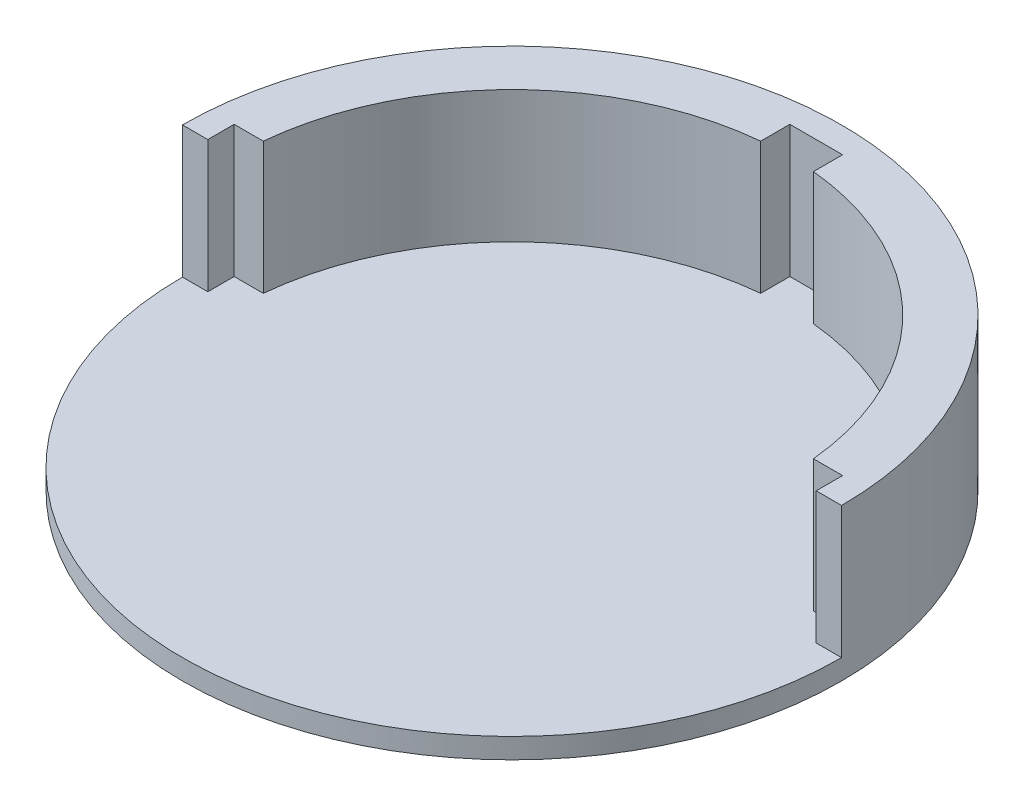
ISO-10303-21;
HEADER;
FILE_DESCRIPTION(('STEP AP214'),'2;1');
FILE_NAME('part.step','',(''),(''),'','','');
FILE_SCHEMA(('AUTOMOTIVE_DESIGN { 1 0 10303 214 1 1 1 1 }'));
ENDSEC;
DATA;
#1=APPLICATION_CONTEXT('core data for automotive mechanical design processes');
#2=APPLICATION_PROTOCOL_DEFINITION('international standard','automotive_design',2000,#1);
#3=PRODUCT_CONTEXT('',#1,'mechanical');
#4=PRODUCT('Part','Part','',(#3));
#5=PRODUCT_RELATED_PRODUCT_CATEGORY('part','',(#4));
#6=PRODUCT_DEFINITION_FORMATION('','',#4);
#7=PRODUCT_DEFINITION_CONTEXT('part definition',#1,'design');
#8=PRODUCT_DEFINITION('design','',#6,#7);
#9=PRODUCT_DEFINITION_SHAPE('','',#8);
#10=(LENGTH_UNIT() NAMED_UNIT(*) SI_UNIT(.MILLI.,.METRE.));
#11=(NAMED_UNIT(*) PLANE_ANGLE_UNIT() SI_UNIT($,.RADIAN.));
#12=(NAMED_UNIT(*) SI_UNIT($,.STERADIAN.) SOLID_ANGLE_UNIT());
#13=UNCERTAINTY_MEASURE_WITH_UNIT(LENGTH_MEASURE(1.E-05),#10,'distance_accuracy_value','');
#14=(GEOMETRIC_REPRESENTATION_CONTEXT(3) GLOBAL_UNCERTAINTY_ASSIGNED_CONTEXT((#13)) GLOBAL_UNIT_ASSIGNED_CONTEXT((#10,
#11,#12)) REPRESENTATION_CONTEXT('',''));
#15=CARTESIAN_POINT('',(0.,0.,0.));
#16=DIRECTION('',(0.,0.,1.));
#17=DIRECTION('',(1.,0.,0.));
#18=AXIS2_PLACEMENT_3D('',#15,#16,#17);
#19=CARTESIAN_POINT('',(0.,2.,0.));
#20=DIRECTION('',(0.,-1.,0.));
#21=DIRECTION('',(0.,0.,-1.));
#22=AXIS2_PLACEMENT_3D('',#19,#20,#21);
#23=CYLINDRICAL_SURFACE('',#22,32.5);
#24=CARTESIAN_POINT('',(0.,15.,0.));
#25=DIRECTION('',(0.,1.,0.));
#26=DIRECTION('',(0.,0.,1.));
#27=AXIS2_PLACEMENT_3D('',#24,#25,#26);
#28=CIRCLE('',#27,32.5);
#29=CARTESIAN_POINT('',(32.5,15.,0.));
#30=VERTEX_POINT('',#29);
#31=CARTESIAN_POINT('',(-32.5,15.,0.));
#32=VERTEX_POINT('',#31);
#33=EDGE_CURVE('E166',#30,#32,#28,.T.);
#34=ORIENTED_EDGE('',*,*,#33,.F.);
#35=DIRECTION('',(0.,-1.,0.));
#36=VECTOR('',#35,1.);
#37=CARTESIAN_POINT('',(32.5,2.,0.));
#38=LINE('',#37,#36);
#39=CARTESIAN_POINT('',(32.5,2.,0.));
#40=VERTEX_POINT('',#39);
#41=EDGE_CURVE('E240',#30,#40,#38,.T.);
#42=ORIENTED_EDGE('',*,*,#41,.T.);
#43=CARTESIAN_POINT('',(0.,2.,0.));
#44=DIRECTION('',(0.,1.,0.));
#45=DIRECTION('',(0.,0.,1.));
#46=AXIS2_PLACEMENT_3D('',#43,#44,#45);
#47=CIRCLE('',#46,32.5);
#48=CARTESIAN_POINT('',(-32.5,2.,0.));
#49=VERTEX_POINT('',#48);
#50=EDGE_CURVE('E176',#49,#40,#47,.T.);
#51=ORIENTED_EDGE('',*,*,#50,.F.);
#52=DIRECTION('',(0.,-1.,0.));
#53=VECTOR('',#52,1.);
#54=CARTESIAN_POINT('',(-32.5,2.,0.));
#55=LINE('',#54,#53);
#56=EDGE_CURVE('E232',#49,#32,#55,.F.);
#57=ORIENTED_EDGE('',*,*,#56,.T.);
#58=EDGE_LOOP('',(#34,#42,#51,#57));
#59=FACE_BOUND('',#58,.T.);
#60=CARTESIAN_POINT('',(0.,0.,0.));
#61=DIRECTION('',(0.,1.,0.));
#62=DIRECTION('',(0.,0.,1.));
#63=AXIS2_PLACEMENT_3D('',#60,#61,#62);
#64=CIRCLE('',#63,32.5);
#65=CARTESIAN_POINT('',(0.,0.,32.5));
#66=VERTEX_POINT('',#65);
#67=EDGE_CURVE('E11',#66,#66,#64,.T.);
#68=ORIENTED_EDGE('',*,*,#67,.T.);
#69=EDGE_LOOP('',(#68));
#70=FACE_BOUND('',#69,.T.);
#71=ADVANCED_FACE('F40',(#59,#70),#23,.T.);
#72=CARTESIAN_POINT('',(0.,0.,0.));
#73=DIRECTION('',(0.,1.,0.));
#74=DIRECTION('',(0.,0.,1.));
#75=AXIS2_PLACEMENT_3D('',#72,#73,#74);
#76=PLANE('',#75);
#77=ORIENTED_EDGE('',*,*,#67,.F.);
#78=EDGE_LOOP('',(#77));
#79=FACE_BOUND('',#78,.T.);
#80=ADVANCED_FACE('F260',(#79),#76,.F.);
#81=CARTESIAN_POINT('',(-30.,15.,0.));
#82=DIRECTION('',(-1.,0.,0.));
#83=DIRECTION('',(0.,0.,1.));
#84=AXIS2_PLACEMENT_3D('',#81,#82,#83);
#85=PLANE('',#84);
#86=DIRECTION('',(0.,0.,-1.));
#87=VECTOR('',#86,1.);
#88=CARTESIAN_POINT('',(-30.,15.,0.));
#89=LINE('',#88,#87);
#90=CARTESIAN_POINT('',(-30.,15.,0.));
#91=VERTEX_POINT('',#90);
#92=CARTESIAN_POINT('',(-30.,15.,-2.60000000000002));
#93=VERTEX_POINT('',#92);
#94=EDGE_CURVE('E101',#91,#93,#89,.T.);
#95=ORIENTED_EDGE('',*,*,#94,.F.);
#96=DIRECTION('',(0.,-1.,0.));
#97=VECTOR('',#96,1.);
#98=CARTESIAN_POINT('',(-30.,15.,0.));
#99=LINE('',#98,#97);
#100=CARTESIAN_POINT('',(-30.,2.,0.));
#101=VERTEX_POINT('',#100);
#102=EDGE_CURVE('E54',#91,#101,#99,.T.);
#103=ORIENTED_EDGE('',*,*,#102,.T.);
#104=DIRECTION('',(0.,0.,-1.));
#105=VECTOR('',#104,1.);
#106=CARTESIAN_POINT('',(-30.,2.,0.));
#107=LINE('',#106,#105);
#108=CARTESIAN_POINT('',(-30.,2.,-2.60000000000002));
#109=VERTEX_POINT('',#108);
#110=EDGE_CURVE('E173',#101,#109,#107,.T.);
#111=ORIENTED_EDGE('',*,*,#110,.T.);
#112=DIRECTION('',(0.,-1.,0.));
#113=VECTOR('',#112,1.);
#114=CARTESIAN_POINT('',(-30.,15.,-2.60000000000002));
#115=LINE('',#114,#113);
#116=EDGE_CURVE('E47',#93,#109,#115,.T.);
#117=ORIENTED_EDGE('',*,*,#116,.F.);
#118=EDGE_LOOP('',(#95,#103,#111,#117));
#119=FACE_BOUND('',#118,.T.);
#120=ADVANCED_FACE('F258',(#119),#85,.F.);
#121=CARTESIAN_POINT('',(0.,15.,-2.60000000000002));
#122=DIRECTION('',(0.,0.,-1.));
#123=DIRECTION('',(-1.,0.,0.));
#124=AXIS2_PLACEMENT_3D('',#121,#122,#123);
#125=PLANE('',#124);
#126=DIRECTION('',(1.,0.,0.));
#127=VECTOR('',#126,1.);
#128=CARTESIAN_POINT('',(0.,2.,-2.60000000000002));
#129=LINE('',#128,#127);
#130=CARTESIAN_POINT('',(-27.1256797149859,2.,-2.60000000000002));
#131=VERTEX_POINT('',#130);
#132=EDGE_CURVE('E175',#109,#131,#129,.T.);
#133=ORIENTED_EDGE('',*,*,#132,.T.);
#134=DIRECTION('',(0.,-1.,0.));
#135=VECTOR('',#134,1.);
#136=CARTESIAN_POINT('',(-27.1256797149859,15.,-2.60000000000002));
#137=LINE('',#136,#135);
#138=CARTESIAN_POINT('',(-27.1256797149859,15.,-2.60000000000002));
#139=VERTEX_POINT('',#138);
#140=EDGE_CURVE('E195',#139,#131,#137,.T.);
#141=ORIENTED_EDGE('',*,*,#140,.F.);
#142=DIRECTION('',(1.,0.,0.));
#143=VECTOR('',#142,1.);
#144=CARTESIAN_POINT('',(0.,15.,-2.60000000000002));
#145=LINE('',#144,#143);
#146=EDGE_CURVE('E153',#93,#139,#145,.T.);
#147=ORIENTED_EDGE('',*,*,#146,.F.);
#148=ORIENTED_EDGE('',*,*,#116,.T.);
#149=EDGE_LOOP('',(#133,#141,#147,#148));
#150=FACE_BOUND('',#149,.T.);
#151=ADVANCED_FACE('F199',(#150),#125,.F.);
#152=CARTESIAN_POINT('',(0.,15.,0.));
#153=DIRECTION('',(0.,-1.,0.));
#154=DIRECTION('',(0.,0.,-1.));
#155=AXIS2_PLACEMENT_3D('',#152,#153,#154);
#156=CYLINDRICAL_SURFACE('',#155,27.25);
#157=CARTESIAN_POINT('',(0.,2.,0.));
#158=DIRECTION('',(0.,1.,0.));
#159=DIRECTION('',(0.,0.,1.));
#160=AXIS2_PLACEMENT_3D('',#157,#158,#159);
#161=CIRCLE('',#160,27.25);
#162=CARTESIAN_POINT('',(-2.59999999999999,2.,-27.1256797149859));
#163=VERTEX_POINT('',#162);
#164=EDGE_CURVE('E172',#163,#131,#161,.T.);
#165=ORIENTED_EDGE('',*,*,#164,.F.);
#166=DIRECTION('',(0.,-1.,0.));
#167=VECTOR('',#166,1.);
#168=CARTESIAN_POINT('',(-2.59999999999999,15.,-27.1256797149859));
#169=LINE('',#168,#167);
#170=CARTESIAN_POINT('',(-2.59999999999999,15.,-27.1256797149859));
#171=VERTEX_POINT('',#170);
#172=EDGE_CURVE('E193',#171,#163,#169,.T.);
#173=ORIENTED_EDGE('',*,*,#172,.F.);
#174=CARTESIAN_POINT('',(0.,15.,0.));
#175=DIRECTION('',(0.,1.,0.));
#176=DIRECTION('',(0.,0.,1.));
#177=AXIS2_PLACEMENT_3D('',#174,#175,#176);
#178=CIRCLE('',#177,27.25);
#179=EDGE_CURVE('E146',#171,#139,#178,.T.);
#180=ORIENTED_EDGE('',*,*,#179,.T.);
#181=ORIENTED_EDGE('',*,*,#140,.T.);
#182=EDGE_LOOP('',(#165,#173,#180,#181));
#183=FACE_BOUND('',#182,.T.);
#184=ADVANCED_FACE('F210',(#183),#156,.F.);
#185=CARTESIAN_POINT('',(-2.59999999999999,15.,0.));
#186=DIRECTION('',(1.,0.,0.));
#187=DIRECTION('',(0.,0.,-1.));
#188=AXIS2_PLACEMENT_3D('',#185,#186,#187);
#189=PLANE('',#188);
#190=DIRECTION('',(0.,0.,1.));
#191=VECTOR('',#190,1.);
#192=CARTESIAN_POINT('',(-2.59999999999999,2.,0.));
#193=LINE('',#192,#191);
#194=CARTESIAN_POINT('',(-2.59999999999999,2.,-30.));
#195=VERTEX_POINT('',#194);
#196=EDGE_CURVE('E179',#195,#163,#193,.T.);
#197=ORIENTED_EDGE('',*,*,#196,.F.);
#198=DIRECTION('',(0.,-1.,0.));
#199=VECTOR('',#198,1.);
#200=CARTESIAN_POINT('',(-2.59999999999999,15.,-30.));
#201=LINE('',#200,#199);
#202=CARTESIAN_POINT('',(-2.59999999999999,15.,-30.));
#203=VERTEX_POINT('',#202);
#204=EDGE_CURVE('E191',#203,#195,#201,.T.);
#205=ORIENTED_EDGE('',*,*,#204,.F.);
#206=DIRECTION('',(0.,0.,1.));
#207=VECTOR('',#206,1.);
#208=CARTESIAN_POINT('',(-2.59999999999999,15.,0.));
#209=LINE('',#208,#207);
#210=EDGE_CURVE('E152',#203,#171,#209,.T.);
#211=ORIENTED_EDGE('',*,*,#210,.T.);
#212=ORIENTED_EDGE('',*,*,#172,.T.);
#213=EDGE_LOOP('',(#197,#205,#211,#212));
#214=FACE_BOUND('',#213,.T.);
#215=ADVANCED_FACE('F212',(#214),#189,.T.);
#216=CARTESIAN_POINT('',(0.,15.,-30.));
#217=DIRECTION('',(0.,0.,-1.));
#218=DIRECTION('',(-1.,0.,0.));
#219=AXIS2_PLACEMENT_3D('',#216,#217,#218);
#220=PLANE('',#219);
#221=DIRECTION('',(1.,0.,0.));
#222=VECTOR('',#221,1.);
#223=CARTESIAN_POINT('',(0.,2.,-30.));
#224=LINE('',#223,#222);
#225=CARTESIAN_POINT('',(2.60000000000001,2.,-30.));
#226=VERTEX_POINT('',#225);
#227=EDGE_CURVE('E182',#195,#226,#224,.T.);
#228=ORIENTED_EDGE('',*,*,#227,.T.);
#229=DIRECTION('',(0.,-1.,0.));
#230=VECTOR('',#229,1.);
#231=CARTESIAN_POINT('',(2.60000000000001,15.,-30.));
#232=LINE('',#231,#230);
#233=CARTESIAN_POINT('',(2.60000000000001,15.,-30.));
#234=VERTEX_POINT('',#233);
#235=EDGE_CURVE('E140',#234,#226,#232,.T.);
#236=ORIENTED_EDGE('',*,*,#235,.F.);
#237=DIRECTION('',(1.,0.,0.));
#238=VECTOR('',#237,1.);
#239=CARTESIAN_POINT('',(0.,15.,-30.));
#240=LINE('',#239,#238);
#241=EDGE_CURVE('E127',#203,#234,#240,.T.);
#242=ORIENTED_EDGE('',*,*,#241,.F.);
#243=ORIENTED_EDGE('',*,*,#204,.T.);
#244=EDGE_LOOP('',(#228,#236,#242,#243));
#245=FACE_BOUND('',#244,.T.);
#246=ADVANCED_FACE('F214',(#245),#220,.F.);
#247=CARTESIAN_POINT('',(2.60000000000001,15.,0.));
#248=DIRECTION('',(1.,0.,0.));
#249=DIRECTION('',(0.,0.,-1.));
#250=AXIS2_PLACEMENT_3D('',#247,#248,#249);
#251=PLANE('',#250);
#252=DIRECTION('',(0.,0.,1.));
#253=VECTOR('',#252,1.);
#254=CARTESIAN_POINT('',(2.60000000000001,2.,0.));
#255=LINE('',#254,#253);
#256=CARTESIAN_POINT('',(2.60000000000001,2.,-27.1256797149859));
#257=VERTEX_POINT('',#256);
#258=EDGE_CURVE('E136',#226,#257,#255,.T.);
#259=ORIENTED_EDGE('',*,*,#258,.T.);
#260=DIRECTION('',(0.,-1.,0.));
#261=VECTOR('',#260,1.);
#262=CARTESIAN_POINT('',(2.60000000000001,15.,-27.1256797149859));
#263=LINE('',#262,#261);
#264=CARTESIAN_POINT('',(2.60000000000001,15.,-27.1256797149859));
#265=VERTEX_POINT('',#264);
#266=EDGE_CURVE('E133',#265,#257,#263,.T.);
#267=ORIENTED_EDGE('',*,*,#266,.F.);
#268=DIRECTION('',(0.,0.,1.));
#269=VECTOR('',#268,1.);
#270=CARTESIAN_POINT('',(2.60000000000001,15.,0.));
#271=LINE('',#270,#269);
#272=EDGE_CURVE('E118',#234,#265,#271,.T.);
#273=ORIENTED_EDGE('',*,*,#272,.F.);
#274=ORIENTED_EDGE('',*,*,#235,.T.);
#275=EDGE_LOOP('',(#259,#267,#273,#274));
#276=FACE_BOUND('',#275,.T.);
#277=ADVANCED_FACE('F134',(#276),#251,.F.);
#278=CARTESIAN_POINT('',(27.1256797149859,2.,-2.60000000000001));
#279=VERTEX_POINT('',#278);
#280=EDGE_CURVE('E169',#279,#257,#161,.T.);
#281=ORIENTED_EDGE('',*,*,#280,.F.);
#282=DIRECTION('',(0.,-1.,0.));
#283=VECTOR('',#282,1.);
#284=CARTESIAN_POINT('',(27.1256797149859,15.,-2.60000000000001));
#285=LINE('',#284,#283);
#286=CARTESIAN_POINT('',(27.1256797149859,15.,-2.60000000000001));
#287=VERTEX_POINT('',#286);
#288=EDGE_CURVE('E141',#287,#279,#285,.T.);
#289=ORIENTED_EDGE('',*,*,#288,.F.);
#290=EDGE_CURVE('E124',#287,#265,#178,.T.);
#291=ORIENTED_EDGE('',*,*,#290,.T.);
#292=ORIENTED_EDGE('',*,*,#266,.T.);
#293=EDGE_LOOP('',(#281,#289,#291,#292));
#294=FACE_BOUND('',#293,.T.);
#295=ADVANCED_FACE('F143',(#294),#156,.F.);
#296=CARTESIAN_POINT('',(0.,15.,-2.6));
#297=DIRECTION('',(0.,0.,1.));
#298=DIRECTION('',(1.,0.,0.));
#299=AXIS2_PLACEMENT_3D('',#296,#297,#298);
#300=PLANE('',#299);
#301=DIRECTION('',(-1.,0.,0.));
#302=VECTOR('',#301,1.);
#303=CARTESIAN_POINT('',(0.,2.,-2.6));
#304=LINE('',#303,#302);
#305=CARTESIAN_POINT('',(30.,2.,-2.60000000000001));
#306=VERTEX_POINT('',#305);
#307=EDGE_CURVE('E171',#306,#279,#304,.T.);
#308=ORIENTED_EDGE('',*,*,#307,.F.);
#309=DIRECTION('',(0.,-1.,0.));
#310=VECTOR('',#309,1.);
#311=CARTESIAN_POINT('',(30.,15.,-2.60000000000001));
#312=LINE('',#311,#310);
#313=CARTESIAN_POINT('',(30.,15.,-2.60000000000001));
#314=VERTEX_POINT('',#313);
#315=EDGE_CURVE('E63',#314,#306,#312,.T.);
#316=ORIENTED_EDGE('',*,*,#315,.F.);
#317=DIRECTION('',(-1.,0.,0.));
#318=VECTOR('',#317,1.);
#319=CARTESIAN_POINT('',(0.,15.,-2.6));
#320=LINE('',#319,#318);
#321=EDGE_CURVE('E144',#314,#287,#320,.T.);
#322=ORIENTED_EDGE('',*,*,#321,.T.);
#323=ORIENTED_EDGE('',*,*,#288,.T.);
#324=EDGE_LOOP('',(#308,#316,#322,#323));
#325=FACE_BOUND('',#324,.T.);
#326=ADVANCED_FACE('F217',(#325),#300,.T.);
#327=CARTESIAN_POINT('',(30.,15.,0.));
#328=DIRECTION('',(1.,0.,0.));
#329=DIRECTION('',(0.,0.,-1.));
#330=AXIS2_PLACEMENT_3D('',#327,#328,#329);
#331=PLANE('',#330);
#332=DIRECTION('',(0.,0.,1.));
#333=VECTOR('',#332,1.);
#334=CARTESIAN_POINT('',(30.,2.,0.));
#335=LINE('',#334,#333);
#336=CARTESIAN_POINT('',(30.,2.,0.));
#337=VERTEX_POINT('',#336);
#338=EDGE_CURVE('E161',#306,#337,#335,.T.);
#339=ORIENTED_EDGE('',*,*,#338,.T.);
#340=DIRECTION('',(0.,1.,0.));
#341=VECTOR('',#340,1.);
#342=CARTESIAN_POINT('',(30.,15.,0.));
#343=LINE('',#342,#341);
#344=CARTESIAN_POINT('',(30.,15.,0.));
#345=VERTEX_POINT('',#344);
#346=EDGE_CURVE('E226',#337,#345,#343,.T.);
#347=ORIENTED_EDGE('',*,*,#346,.T.);
#348=DIRECTION('',(0.,0.,1.));
#349=VECTOR('',#348,1.);
#350=CARTESIAN_POINT('',(30.,15.,0.));
#351=LINE('',#350,#349);
#352=EDGE_CURVE('E147',#314,#345,#351,.T.);
#353=ORIENTED_EDGE('',*,*,#352,.F.);
#354=ORIENTED_EDGE('',*,*,#315,.T.);
#355=EDGE_LOOP('',(#339,#347,#353,#354));
#356=FACE_BOUND('',#355,.T.);
#357=ADVANCED_FACE('F224',(#356),#331,.F.);
#358=CARTESIAN_POINT('',(0.,15.,0.));
#359=DIRECTION('',(0.,1.,0.));
#360=DIRECTION('',(0.,0.,1.));
#361=AXIS2_PLACEMENT_3D('',#358,#359,#360);
#362=PLANE('',#361);
#363=DIRECTION('',(-1.,0.,0.));
#364=VECTOR('',#363,1.);
#365=CARTESIAN_POINT('',(35.8547452636856,15.,0.));
#366=LINE('',#365,#364);
#367=EDGE_CURVE('E221',#30,#345,#366,.T.);
#368=ORIENTED_EDGE('',*,*,#367,.F.);
#369=ORIENTED_EDGE('',*,*,#33,.T.);
#370=EDGE_CURVE('E253',#91,#32,#366,.T.);
#371=ORIENTED_EDGE('',*,*,#370,.F.);
#372=ORIENTED_EDGE('',*,*,#94,.T.);
#373=ORIENTED_EDGE('',*,*,#146,.T.);
#374=ORIENTED_EDGE('',*,*,#179,.F.);
#375=ORIENTED_EDGE('',*,*,#210,.F.);
#376=ORIENTED_EDGE('',*,*,#241,.T.);
#377=ORIENTED_EDGE('',*,*,#272,.T.);
#378=ORIENTED_EDGE('',*,*,#290,.F.);
#379=ORIENTED_EDGE('',*,*,#321,.F.);
#380=ORIENTED_EDGE('',*,*,#352,.T.);
#381=EDGE_LOOP('',(#368,#369,#371,#372,#373,#374,#375,#376,#377,#378,#379,#380));
#382=FACE_BOUND('',#381,.T.);
#383=ADVANCED_FACE('F121',(#382),#362,.T.);
#384=CARTESIAN_POINT('',(0.,2.,0.));
#385=DIRECTION('',(0.,1.,0.));
#386=DIRECTION('',(0.,0.,1.));
#387=AXIS2_PLACEMENT_3D('',#384,#385,#386);
#388=PLANE('',#387);
#389=ORIENTED_EDGE('',*,*,#110,.F.);
#390=DIRECTION('',(1.,0.,0.));
#391=VECTOR('',#390,1.);
#392=CARTESIAN_POINT('',(35.8547452636856,2.,0.));
#393=LINE('',#392,#391);
#394=EDGE_CURVE('E230',#49,#101,#393,.T.);
#395=ORIENTED_EDGE('',*,*,#394,.F.);
#396=ORIENTED_EDGE('',*,*,#50,.T.);
#397=EDGE_CURVE('E234',#337,#40,#393,.T.);
#398=ORIENTED_EDGE('',*,*,#397,.F.);
#399=ORIENTED_EDGE('',*,*,#338,.F.);
#400=ORIENTED_EDGE('',*,*,#307,.T.);
#401=ORIENTED_EDGE('',*,*,#280,.T.);
#402=ORIENTED_EDGE('',*,*,#258,.F.);
#403=ORIENTED_EDGE('',*,*,#227,.F.);
#404=ORIENTED_EDGE('',*,*,#196,.T.);
#405=ORIENTED_EDGE('',*,*,#164,.T.);
#406=ORIENTED_EDGE('',*,*,#132,.F.);
#407=EDGE_LOOP('',(#389,#395,#396,#398,#399,#400,#401,#402,#403,#404,#405,#406));
#408=FACE_BOUND('',#407,.T.);
#409=ADVANCED_FACE('F204',(#408),#388,.T.);
#410=CARTESIAN_POINT('',(35.8547452636856,-77.8522708356182,0.));
#411=DIRECTION('',(0.,0.,-1.));
#412=DIRECTION('',(-1.,0.,0.));
#413=AXIS2_PLACEMENT_3D('',#410,#411,#412);
#414=PLANE('',#413);
#415=ORIENTED_EDGE('',*,*,#367,.T.);
#416=ORIENTED_EDGE('',*,*,#346,.F.);
#417=ORIENTED_EDGE('',*,*,#397,.T.);
#418=ORIENTED_EDGE('',*,*,#41,.F.);
#419=EDGE_LOOP('',(#415,#416,#417,#418));
#420=FACE_BOUND('',#419,.T.);
#421=ADVANCED_FACE('F249',(#420),#414,.F.);
#422=ORIENTED_EDGE('',*,*,#394,.T.);
#423=ORIENTED_EDGE('',*,*,#102,.F.);
#424=ORIENTED_EDGE('',*,*,#370,.T.);
#425=ORIENTED_EDGE('',*,*,#56,.F.);
#426=EDGE_LOOP('',(#422,#423,#424,#425));
#427=FACE_BOUND('',#426,.T.);
#428=ADVANCED_FACE('F254',(#427),#414,.F.);
#429=CLOSED_SHELL('',(#71,#80,#120,#151,#184,#215,#246,#277,#295,#326,#357,#383,#409,#421,#428));
#430=MANIFOLD_SOLID_BREP('B2',#429);
#431=ADVANCED_BREP_SHAPE_REPRESENTATION('',(#18,#430),#14);
#432=SHAPE_DEFINITION_REPRESENTATION(#9,#431);
ENDSEC;
END-ISO-10303-21;
